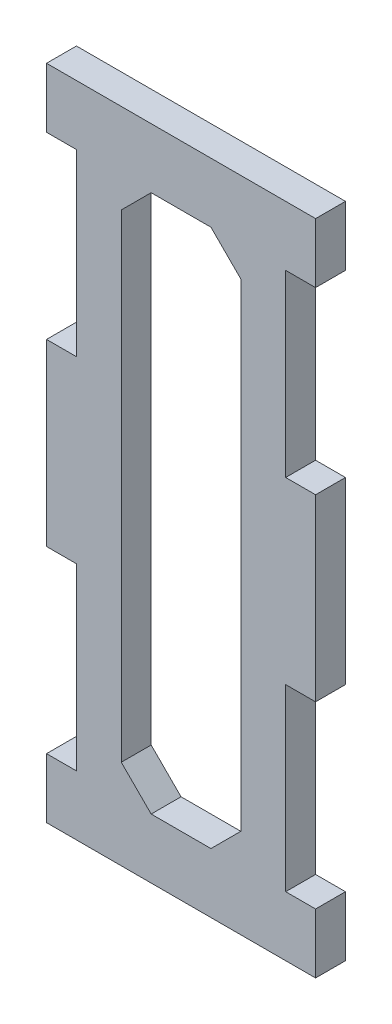
ISO-10303-21;
HEADER;
FILE_DESCRIPTION(('STEP AP214'),'2;1');
FILE_NAME('part.step','',(''),(''),'','','');
FILE_SCHEMA(('AUTOMOTIVE_DESIGN { 1 0 10303 214 1 1 1 1 }'));
ENDSEC;
DATA;
#1=APPLICATION_CONTEXT('core data for automotive mechanical design processes');
#2=APPLICATION_PROTOCOL_DEFINITION('international standard','automotive_design',2000,#1);
#3=PRODUCT_CONTEXT('',#1,'mechanical');
#4=PRODUCT('Part','Part','',(#3));
#5=PRODUCT_RELATED_PRODUCT_CATEGORY('part','',(#4));
#6=PRODUCT_DEFINITION_FORMATION('','',#4);
#7=PRODUCT_DEFINITION_CONTEXT('part definition',#1,'design');
#8=PRODUCT_DEFINITION('design','',#6,#7);
#9=PRODUCT_DEFINITION_SHAPE('','',#8);
#10=(LENGTH_UNIT() NAMED_UNIT(*) SI_UNIT(.MILLI.,.METRE.));
#11=(NAMED_UNIT(*) PLANE_ANGLE_UNIT() SI_UNIT($,.RADIAN.));
#12=(NAMED_UNIT(*) SI_UNIT($,.STERADIAN.) SOLID_ANGLE_UNIT());
#13=UNCERTAINTY_MEASURE_WITH_UNIT(LENGTH_MEASURE(1.E-05),#10,'distance_accuracy_value','');
#14=(GEOMETRIC_REPRESENTATION_CONTEXT(3) GLOBAL_UNCERTAINTY_ASSIGNED_CONTEXT((#13)) GLOBAL_UNIT_ASSIGNED_CONTEXT((#10,
#11,#12)) REPRESENTATION_CONTEXT('',''));
#15=CARTESIAN_POINT('',(0.,0.,0.));
#16=DIRECTION('',(0.,0.,1.));
#17=DIRECTION('',(1.,0.,0.));
#18=AXIS2_PLACEMENT_3D('',#15,#16,#17);
#19=CARTESIAN_POINT('',(0.,0.,10.));
#20=DIRECTION('',(1.,0.,0.));
#21=DIRECTION('',(0.,0.,-1.));
#22=AXIS2_PLACEMENT_3D('',#19,#20,#21);
#23=PLANE('',#22);
#24=DIRECTION('',(0.,-1.,0.));
#25=VECTOR('',#24,1.);
#26=CARTESIAN_POINT('',(0.,0.,0.));
#27=LINE('',#26,#25);
#28=CARTESIAN_POINT('',(0.,20.,0.));
#29=VERTEX_POINT('',#28);
#30=CARTESIAN_POINT('',(0.,0.,0.));
#31=VERTEX_POINT('',#30);
#32=EDGE_CURVE('E274',#29,#31,#27,.T.);
#33=ORIENTED_EDGE('',*,*,#32,.T.);
#34=DIRECTION('',(0.,0.,-1.));
#35=VECTOR('',#34,1.);
#36=CARTESIAN_POINT('',(0.,0.,10.));
#37=LINE('',#36,#35);
#38=CARTESIAN_POINT('',(0.,0.,10.));
#39=VERTEX_POINT('',#38);
#40=EDGE_CURVE('E11',#39,#31,#37,.T.);
#41=ORIENTED_EDGE('',*,*,#40,.F.);
#42=DIRECTION('',(0.,-1.,0.));
#43=VECTOR('',#42,1.);
#44=CARTESIAN_POINT('',(0.,0.,10.));
#45=LINE('',#44,#43);
#46=CARTESIAN_POINT('',(0.,20.,10.));
#47=VERTEX_POINT('',#46);
#48=EDGE_CURVE('E286',#47,#39,#45,.T.);
#49=ORIENTED_EDGE('',*,*,#48,.F.);
#50=DIRECTION('',(0.,0.,-1.));
#51=VECTOR('',#50,1.);
#52=CARTESIAN_POINT('',(0.,20.,10.));
#53=LINE('',#52,#51);
#54=EDGE_CURVE('E328',#47,#29,#53,.T.);
#55=ORIENTED_EDGE('',*,*,#54,.T.);
#56=EDGE_LOOP('',(#33,#41,#49,#55));
#57=FACE_BOUND('',#56,.T.);
#58=ADVANCED_FACE('F33',(#57),#23,.F.);
#59=CARTESIAN_POINT('',(0.,0.,10.));
#60=DIRECTION('',(0.,1.,0.));
#61=DIRECTION('',(-1.,0.,0.));
#62=AXIS2_PLACEMENT_3D('',#59,#60,#61);
#63=PLANE('',#62);
#64=DIRECTION('',(1.,0.,0.));
#65=VECTOR('',#64,1.);
#66=CARTESIAN_POINT('',(0.,0.,0.));
#67=LINE('',#66,#65);
#68=CARTESIAN_POINT('',(90.,0.,0.));
#69=VERTEX_POINT('',#68);
#70=EDGE_CURVE('E331',#31,#69,#67,.T.);
#71=ORIENTED_EDGE('',*,*,#70,.T.);
#72=DIRECTION('',(0.,0.,-1.));
#73=VECTOR('',#72,1.);
#74=CARTESIAN_POINT('',(90.,0.,10.));
#75=LINE('',#74,#73);
#76=CARTESIAN_POINT('',(90.,0.,10.));
#77=VERTEX_POINT('',#76);
#78=EDGE_CURVE('E40',#77,#69,#75,.T.);
#79=ORIENTED_EDGE('',*,*,#78,.F.);
#80=DIRECTION('',(1.,0.,0.));
#81=VECTOR('',#80,1.);
#82=CARTESIAN_POINT('',(0.,0.,10.));
#83=LINE('',#82,#81);
#84=EDGE_CURVE('E289',#39,#77,#83,.T.);
#85=ORIENTED_EDGE('',*,*,#84,.F.);
#86=ORIENTED_EDGE('',*,*,#40,.T.);
#87=EDGE_LOOP('',(#71,#79,#85,#86));
#88=FACE_BOUND('',#87,.T.);
#89=ADVANCED_FACE('F446',(#88),#63,.F.);
#90=CARTESIAN_POINT('',(90.,0.,10.));
#91=DIRECTION('',(-1.,0.,0.));
#92=DIRECTION('',(0.,0.,1.));
#93=AXIS2_PLACEMENT_3D('',#90,#91,#92);
#94=PLANE('',#93);
#95=DIRECTION('',(0.,1.,0.));
#96=VECTOR('',#95,1.);
#97=CARTESIAN_POINT('',(90.,0.,0.));
#98=LINE('',#97,#96);
#99=CARTESIAN_POINT('',(90.,20.,0.));
#100=VERTEX_POINT('',#99);
#101=EDGE_CURVE('E333',#69,#100,#98,.T.);
#102=ORIENTED_EDGE('',*,*,#101,.T.);
#103=DIRECTION('',(0.,0.,-1.));
#104=VECTOR('',#103,1.);
#105=CARTESIAN_POINT('',(90.,20.,10.));
#106=LINE('',#105,#104);
#107=CARTESIAN_POINT('',(90.,20.,10.));
#108=VERTEX_POINT('',#107);
#109=EDGE_CURVE('E418',#108,#100,#106,.T.);
#110=ORIENTED_EDGE('',*,*,#109,.F.);
#111=DIRECTION('',(0.,1.,0.));
#112=VECTOR('',#111,1.);
#113=CARTESIAN_POINT('',(90.,0.,10.));
#114=LINE('',#113,#112);
#115=EDGE_CURVE('E292',#77,#108,#114,.T.);
#116=ORIENTED_EDGE('',*,*,#115,.F.);
#117=ORIENTED_EDGE('',*,*,#78,.T.);
#118=EDGE_LOOP('',(#102,#110,#116,#117));
#119=FACE_BOUND('',#118,.T.);
#120=ADVANCED_FACE('F425',(#119),#94,.F.);
#121=CARTESIAN_POINT('',(90.,20.,10.));
#122=DIRECTION('',(0.,-1.,0.));
#123=DIRECTION('',(1.,0.,0.));
#124=AXIS2_PLACEMENT_3D('',#121,#122,#123);
#125=PLANE('',#124);
#126=DIRECTION('',(-1.,0.,0.));
#127=VECTOR('',#126,1.);
#128=CARTESIAN_POINT('',(90.,20.,0.));
#129=LINE('',#128,#127);
#130=CARTESIAN_POINT('',(80.,20.,0.));
#131=VERTEX_POINT('',#130);
#132=EDGE_CURVE('E335',#100,#131,#129,.T.);
#133=ORIENTED_EDGE('',*,*,#132,.T.);
#134=DIRECTION('',(0.,0.,-1.));
#135=VECTOR('',#134,1.);
#136=CARTESIAN_POINT('',(80.,20.,10.));
#137=LINE('',#136,#135);
#138=CARTESIAN_POINT('',(80.,20.,10.));
#139=VERTEX_POINT('',#138);
#140=EDGE_CURVE('E415',#139,#131,#137,.T.);
#141=ORIENTED_EDGE('',*,*,#140,.F.);
#142=DIRECTION('',(-1.,0.,0.));
#143=VECTOR('',#142,1.);
#144=CARTESIAN_POINT('',(90.,20.,10.));
#145=LINE('',#144,#143);
#146=EDGE_CURVE('E294',#108,#139,#145,.T.);
#147=ORIENTED_EDGE('',*,*,#146,.F.);
#148=ORIENTED_EDGE('',*,*,#109,.T.);
#149=EDGE_LOOP('',(#133,#141,#147,#148));
#150=FACE_BOUND('',#149,.T.);
#151=ADVANCED_FACE('F434',(#150),#125,.F.);
#152=CARTESIAN_POINT('',(80.,20.,10.));
#153=DIRECTION('',(-1.,0.,0.));
#154=DIRECTION('',(0.,-1.,0.));
#155=AXIS2_PLACEMENT_3D('',#152,#153,#154);
#156=PLANE('',#155);
#157=DIRECTION('',(0.,1.,0.));
#158=VECTOR('',#157,1.);
#159=CARTESIAN_POINT('',(80.,20.,0.));
#160=LINE('',#159,#158);
#161=CARTESIAN_POINT('',(80.,80.,0.));
#162=VERTEX_POINT('',#161);
#163=EDGE_CURVE('E337',#131,#162,#160,.T.);
#164=ORIENTED_EDGE('',*,*,#163,.T.);
#165=DIRECTION('',(0.,0.,-1.));
#166=VECTOR('',#165,1.);
#167=CARTESIAN_POINT('',(80.,80.,10.));
#168=LINE('',#167,#166);
#169=CARTESIAN_POINT('',(80.,80.,10.));
#170=VERTEX_POINT('',#169);
#171=EDGE_CURVE('E412',#170,#162,#168,.T.);
#172=ORIENTED_EDGE('',*,*,#171,.F.);
#173=DIRECTION('',(0.,1.,0.));
#174=VECTOR('',#173,1.);
#175=CARTESIAN_POINT('',(80.,20.,10.));
#176=LINE('',#175,#174);
#177=EDGE_CURVE('E296',#139,#170,#176,.T.);
#178=ORIENTED_EDGE('',*,*,#177,.F.);
#179=ORIENTED_EDGE('',*,*,#140,.T.);
#180=EDGE_LOOP('',(#164,#172,#178,#179));
#181=FACE_BOUND('',#180,.T.);
#182=ADVANCED_FACE('F438',(#181),#156,.F.);
#183=CARTESIAN_POINT('',(80.,80.,10.));
#184=DIRECTION('',(0.,1.,0.));
#185=DIRECTION('',(0.,0.,1.));
#186=AXIS2_PLACEMENT_3D('',#183,#184,#185);
#187=PLANE('',#186);
#188=DIRECTION('',(1.,0.,0.));
#189=VECTOR('',#188,1.);
#190=CARTESIAN_POINT('',(80.,80.,0.));
#191=LINE('',#190,#189);
#192=CARTESIAN_POINT('',(90.,80.,0.));
#193=VERTEX_POINT('',#192);
#194=EDGE_CURVE('E339',#162,#193,#191,.T.);
#195=ORIENTED_EDGE('',*,*,#194,.T.);
#196=DIRECTION('',(0.,0.,-1.));
#197=VECTOR('',#196,1.);
#198=CARTESIAN_POINT('',(90.,80.,10.));
#199=LINE('',#198,#197);
#200=CARTESIAN_POINT('',(90.,80.,10.));
#201=VERTEX_POINT('',#200);
#202=EDGE_CURVE('E409',#201,#193,#199,.T.);
#203=ORIENTED_EDGE('',*,*,#202,.F.);
#204=DIRECTION('',(1.,0.,0.));
#205=VECTOR('',#204,1.);
#206=CARTESIAN_POINT('',(80.,80.,10.));
#207=LINE('',#206,#205);
#208=EDGE_CURVE('E298',#170,#201,#207,.T.);
#209=ORIENTED_EDGE('',*,*,#208,.F.);
#210=ORIENTED_EDGE('',*,*,#171,.T.);
#211=EDGE_LOOP('',(#195,#203,#209,#210));
#212=FACE_BOUND('',#211,.T.);
#213=ADVANCED_FACE('F519',(#212),#187,.F.);
#214=CARTESIAN_POINT('',(90.,80.,10.));
#215=DIRECTION('',(-1.,0.,0.));
#216=DIRECTION('',(0.,0.,1.));
#217=AXIS2_PLACEMENT_3D('',#214,#215,#216);
#218=PLANE('',#217);
#219=DIRECTION('',(0.,1.,0.));
#220=VECTOR('',#219,1.);
#221=CARTESIAN_POINT('',(90.,80.,0.));
#222=LINE('',#221,#220);
#223=CARTESIAN_POINT('',(90.,140.,0.));
#224=VERTEX_POINT('',#223);
#225=EDGE_CURVE('E341',#193,#224,#222,.T.);
#226=ORIENTED_EDGE('',*,*,#225,.T.);
#227=DIRECTION('',(0.,0.,-1.));
#228=VECTOR('',#227,1.);
#229=CARTESIAN_POINT('',(90.,140.,10.));
#230=LINE('',#229,#228);
#231=CARTESIAN_POINT('',(90.,140.,10.));
#232=VERTEX_POINT('',#231);
#233=EDGE_CURVE('E406',#232,#224,#230,.T.);
#234=ORIENTED_EDGE('',*,*,#233,.F.);
#235=DIRECTION('',(0.,1.,0.));
#236=VECTOR('',#235,1.);
#237=CARTESIAN_POINT('',(90.,80.,10.));
#238=LINE('',#237,#236);
#239=EDGE_CURVE('E300',#201,#232,#238,.T.);
#240=ORIENTED_EDGE('',*,*,#239,.F.);
#241=ORIENTED_EDGE('',*,*,#202,.T.);
#242=EDGE_LOOP('',(#226,#234,#240,#241));
#243=FACE_BOUND('',#242,.T.);
#244=ADVANCED_FACE('F517',(#243),#218,.F.);
#245=CARTESIAN_POINT('',(90.,140.,10.));
#246=DIRECTION('',(0.,-1.,0.));
#247=DIRECTION('',(0.,0.,-1.));
#248=AXIS2_PLACEMENT_3D('',#245,#246,#247);
#249=PLANE('',#248);
#250=DIRECTION('',(-1.,0.,0.));
#251=VECTOR('',#250,1.);
#252=CARTESIAN_POINT('',(90.,140.,0.));
#253=LINE('',#252,#251);
#254=CARTESIAN_POINT('',(80.,140.,0.));
#255=VERTEX_POINT('',#254);
#256=EDGE_CURVE('E343',#224,#255,#253,.T.);
#257=ORIENTED_EDGE('',*,*,#256,.T.);
#258=DIRECTION('',(0.,0.,-1.));
#259=VECTOR('',#258,1.);
#260=CARTESIAN_POINT('',(80.,140.,10.));
#261=LINE('',#260,#259);
#262=CARTESIAN_POINT('',(80.,140.,10.));
#263=VERTEX_POINT('',#262);
#264=EDGE_CURVE('E403',#263,#255,#261,.T.);
#265=ORIENTED_EDGE('',*,*,#264,.F.);
#266=DIRECTION('',(-1.,0.,0.));
#267=VECTOR('',#266,1.);
#268=CARTESIAN_POINT('',(90.,140.,10.));
#269=LINE('',#268,#267);
#270=EDGE_CURVE('E302',#232,#263,#269,.T.);
#271=ORIENTED_EDGE('',*,*,#270,.F.);
#272=ORIENTED_EDGE('',*,*,#233,.T.);
#273=EDGE_LOOP('',(#257,#265,#271,#272));
#274=FACE_BOUND('',#273,.T.);
#275=ADVANCED_FACE('F512',(#274),#249,.F.);
#276=CARTESIAN_POINT('',(80.,140.,10.));
#277=DIRECTION('',(-1.,0.,0.));
#278=DIRECTION('',(0.,-1.,0.));
#279=AXIS2_PLACEMENT_3D('',#276,#277,#278);
#280=PLANE('',#279);
#281=DIRECTION('',(0.,1.,0.));
#282=VECTOR('',#281,1.);
#283=CARTESIAN_POINT('',(80.,140.,0.));
#284=LINE('',#283,#282);
#285=CARTESIAN_POINT('',(79.9999999999999,200.,0.));
#286=VERTEX_POINT('',#285);
#287=EDGE_CURVE('E345',#255,#286,#284,.T.);
#288=ORIENTED_EDGE('',*,*,#287,.T.);
#289=DIRECTION('',(0.,0.,-1.));
#290=VECTOR('',#289,1.);
#291=CARTESIAN_POINT('',(79.9999999999999,200.,10.));
#292=LINE('',#291,#290);
#293=CARTESIAN_POINT('',(79.9999999999999,200.,10.));
#294=VERTEX_POINT('',#293);
#295=EDGE_CURVE('E400',#294,#286,#292,.T.);
#296=ORIENTED_EDGE('',*,*,#295,.F.);
#297=DIRECTION('',(0.,1.,0.));
#298=VECTOR('',#297,1.);
#299=CARTESIAN_POINT('',(80.,140.,10.));
#300=LINE('',#299,#298);
#301=EDGE_CURVE('E304',#263,#294,#300,.T.);
#302=ORIENTED_EDGE('',*,*,#301,.F.);
#303=ORIENTED_EDGE('',*,*,#264,.T.);
#304=EDGE_LOOP('',(#288,#296,#302,#303));
#305=FACE_BOUND('',#304,.T.);
#306=ADVANCED_FACE('F507',(#305),#280,.F.);
#307=CARTESIAN_POINT('',(79.9999999999999,200.,10.));
#308=DIRECTION('',(0.,1.,0.));
#309=DIRECTION('',(0.,0.,1.));
#310=AXIS2_PLACEMENT_3D('',#307,#308,#309);
#311=PLANE('',#310);
#312=DIRECTION('',(1.,0.,0.));
#313=VECTOR('',#312,1.);
#314=CARTESIAN_POINT('',(79.9999999999999,200.,0.));
#315=LINE('',#314,#313);
#316=CARTESIAN_POINT('',(89.9999999999999,200.,0.));
#317=VERTEX_POINT('',#316);
#318=EDGE_CURVE('E347',#286,#317,#315,.T.);
#319=ORIENTED_EDGE('',*,*,#318,.T.);
#320=DIRECTION('',(0.,0.,-1.));
#321=VECTOR('',#320,1.);
#322=CARTESIAN_POINT('',(89.9999999999999,200.,10.));
#323=LINE('',#322,#321);
#324=CARTESIAN_POINT('',(89.9999999999999,200.,10.));
#325=VERTEX_POINT('',#324);
#326=EDGE_CURVE('E397',#325,#317,#323,.T.);
#327=ORIENTED_EDGE('',*,*,#326,.F.);
#328=DIRECTION('',(1.,0.,0.));
#329=VECTOR('',#328,1.);
#330=CARTESIAN_POINT('',(79.9999999999999,200.,10.));
#331=LINE('',#330,#329);
#332=EDGE_CURVE('E306',#294,#325,#331,.T.);
#333=ORIENTED_EDGE('',*,*,#332,.F.);
#334=ORIENTED_EDGE('',*,*,#295,.T.);
#335=EDGE_LOOP('',(#319,#327,#333,#334));
#336=FACE_BOUND('',#335,.T.);
#337=ADVANCED_FACE('F503',(#336),#311,.F.);
#338=CARTESIAN_POINT('',(89.9999999999999,200.,10.));
#339=DIRECTION('',(-1.,0.,0.));
#340=DIRECTION('',(0.,-1.,0.));
#341=AXIS2_PLACEMENT_3D('',#338,#339,#340);
#342=PLANE('',#341);
#343=DIRECTION('',(0.,1.,0.));
#344=VECTOR('',#343,1.);
#345=CARTESIAN_POINT('',(89.9999999999999,200.,0.));
#346=LINE('',#345,#344);
#347=CARTESIAN_POINT('',(89.9999999999999,220.,0.));
#348=VERTEX_POINT('',#347);
#349=EDGE_CURVE('E349',#317,#348,#346,.T.);
#350=ORIENTED_EDGE('',*,*,#349,.T.);
#351=DIRECTION('',(0.,0.,-1.));
#352=VECTOR('',#351,1.);
#353=CARTESIAN_POINT('',(89.9999999999999,220.,10.));
#354=LINE('',#353,#352);
#355=CARTESIAN_POINT('',(89.9999999999999,220.,10.));
#356=VERTEX_POINT('',#355);
#357=EDGE_CURVE('E394',#356,#348,#354,.T.);
#358=ORIENTED_EDGE('',*,*,#357,.F.);
#359=DIRECTION('',(0.,1.,0.));
#360=VECTOR('',#359,1.);
#361=CARTESIAN_POINT('',(89.9999999999999,200.,10.));
#362=LINE('',#361,#360);
#363=EDGE_CURVE('E308',#325,#356,#362,.T.);
#364=ORIENTED_EDGE('',*,*,#363,.F.);
#365=ORIENTED_EDGE('',*,*,#326,.T.);
#366=EDGE_LOOP('',(#350,#358,#364,#365));
#367=FACE_BOUND('',#366,.T.);
#368=ADVANCED_FACE('F498',(#367),#342,.F.);
#369=CARTESIAN_POINT('',(0.,220.,10.));
#370=DIRECTION('',(0.,-1.,0.));
#371=DIRECTION('',(0.,0.,-1.));
#372=AXIS2_PLACEMENT_3D('',#369,#370,#371);
#373=PLANE('',#372);
#374=DIRECTION('',(-1.,0.,0.));
#375=VECTOR('',#374,1.);
#376=CARTESIAN_POINT('',(0.,220.,0.));
#377=LINE('',#376,#375);
#378=CARTESIAN_POINT('',(0.,220.,0.));
#379=VERTEX_POINT('',#378);
#380=EDGE_CURVE('E351',#348,#379,#377,.T.);
#381=ORIENTED_EDGE('',*,*,#380,.T.);
#382=DIRECTION('',(0.,0.,-1.));
#383=VECTOR('',#382,1.);
#384=CARTESIAN_POINT('',(0.,220.,10.));
#385=LINE('',#384,#383);
#386=CARTESIAN_POINT('',(0.,220.,10.));
#387=VERTEX_POINT('',#386);
#388=EDGE_CURVE('E391',#387,#379,#385,.T.);
#389=ORIENTED_EDGE('',*,*,#388,.F.);
#390=DIRECTION('',(-1.,0.,0.));
#391=VECTOR('',#390,1.);
#392=CARTESIAN_POINT('',(0.,220.,10.));
#393=LINE('',#392,#391);
#394=EDGE_CURVE('E310',#356,#387,#393,.T.);
#395=ORIENTED_EDGE('',*,*,#394,.F.);
#396=ORIENTED_EDGE('',*,*,#357,.T.);
#397=EDGE_LOOP('',(#381,#389,#395,#396));
#398=FACE_BOUND('',#397,.T.);
#399=ADVANCED_FACE('F492',(#398),#373,.F.);
#400=CARTESIAN_POINT('',(0.,200.,10.));
#401=DIRECTION('',(1.,0.,0.));
#402=DIRECTION('',(0.,0.,-1.));
#403=AXIS2_PLACEMENT_3D('',#400,#401,#402);
#404=PLANE('',#403);
#405=DIRECTION('',(0.,-1.,0.));
#406=VECTOR('',#405,1.);
#407=CARTESIAN_POINT('',(0.,200.,0.));
#408=LINE('',#407,#406);
#409=CARTESIAN_POINT('',(0.,200.,0.));
#410=VERTEX_POINT('',#409);
#411=EDGE_CURVE('E353',#379,#410,#408,.T.);
#412=ORIENTED_EDGE('',*,*,#411,.T.);
#413=DIRECTION('',(0.,0.,-1.));
#414=VECTOR('',#413,1.);
#415=CARTESIAN_POINT('',(0.,200.,10.));
#416=LINE('',#415,#414);
#417=CARTESIAN_POINT('',(0.,200.,10.));
#418=VERTEX_POINT('',#417);
#419=EDGE_CURVE('E388',#418,#410,#416,.T.);
#420=ORIENTED_EDGE('',*,*,#419,.F.);
#421=DIRECTION('',(0.,-1.,0.));
#422=VECTOR('',#421,1.);
#423=CARTESIAN_POINT('',(0.,200.,10.));
#424=LINE('',#423,#422);
#425=EDGE_CURVE('E312',#387,#418,#424,.T.);
#426=ORIENTED_EDGE('',*,*,#425,.F.);
#427=ORIENTED_EDGE('',*,*,#388,.T.);
#428=EDGE_LOOP('',(#412,#420,#426,#427));
#429=FACE_BOUND('',#428,.T.);
#430=ADVANCED_FACE('F488',(#429),#404,.F.);
#431=CARTESIAN_POINT('',(10.,200.,10.));
#432=DIRECTION('',(0.,1.,0.));
#433=DIRECTION('',(0.,0.,1.));
#434=AXIS2_PLACEMENT_3D('',#431,#432,#433);
#435=PLANE('',#434);
#436=DIRECTION('',(1.,0.,0.));
#437=VECTOR('',#436,1.);
#438=CARTESIAN_POINT('',(10.,200.,0.));
#439=LINE('',#438,#437);
#440=CARTESIAN_POINT('',(10.,200.,0.));
#441=VERTEX_POINT('',#440);
#442=EDGE_CURVE('E355',#410,#441,#439,.T.);
#443=ORIENTED_EDGE('',*,*,#442,.T.);
#444=DIRECTION('',(0.,0.,-1.));
#445=VECTOR('',#444,1.);
#446=CARTESIAN_POINT('',(10.,200.,10.));
#447=LINE('',#446,#445);
#448=CARTESIAN_POINT('',(10.,200.,10.));
#449=VERTEX_POINT('',#448);
#450=EDGE_CURVE('E385',#449,#441,#447,.T.);
#451=ORIENTED_EDGE('',*,*,#450,.F.);
#452=DIRECTION('',(1.,0.,0.));
#453=VECTOR('',#452,1.);
#454=CARTESIAN_POINT('',(10.,200.,10.));
#455=LINE('',#454,#453);
#456=EDGE_CURVE('E314',#418,#449,#455,.T.);
#457=ORIENTED_EDGE('',*,*,#456,.F.);
#458=ORIENTED_EDGE('',*,*,#419,.T.);
#459=EDGE_LOOP('',(#443,#451,#457,#458));
#460=FACE_BOUND('',#459,.T.);
#461=ADVANCED_FACE('F483',(#460),#435,.F.);
#462=CARTESIAN_POINT('',(10.,140.,10.));
#463=DIRECTION('',(1.,0.,0.));
#464=DIRECTION('',(0.,1.,0.));
#465=AXIS2_PLACEMENT_3D('',#462,#463,#464);
#466=PLANE('',#465);
#467=DIRECTION('',(0.,-1.,0.));
#468=VECTOR('',#467,1.);
#469=CARTESIAN_POINT('',(10.,140.,0.));
#470=LINE('',#469,#468);
#471=CARTESIAN_POINT('',(10.,140.,0.));
#472=VERTEX_POINT('',#471);
#473=EDGE_CURVE('E357',#441,#472,#470,.T.);
#474=ORIENTED_EDGE('',*,*,#473,.T.);
#475=DIRECTION('',(0.,0.,-1.));
#476=VECTOR('',#475,1.);
#477=CARTESIAN_POINT('',(10.,140.,10.));
#478=LINE('',#477,#476);
#479=CARTESIAN_POINT('',(10.,140.,10.));
#480=VERTEX_POINT('',#479);
#481=EDGE_CURVE('E382',#480,#472,#478,.T.);
#482=ORIENTED_EDGE('',*,*,#481,.F.);
#483=DIRECTION('',(0.,-1.,0.));
#484=VECTOR('',#483,1.);
#485=CARTESIAN_POINT('',(10.,140.,10.));
#486=LINE('',#485,#484);
#487=EDGE_CURVE('E316',#449,#480,#486,.T.);
#488=ORIENTED_EDGE('',*,*,#487,.F.);
#489=ORIENTED_EDGE('',*,*,#450,.T.);
#490=EDGE_LOOP('',(#474,#482,#488,#489));
#491=FACE_BOUND('',#490,.T.);
#492=ADVANCED_FACE('F477',(#491),#466,.F.);
#493=CARTESIAN_POINT('',(0.,140.,10.));
#494=DIRECTION('',(0.,-1.,0.));
#495=DIRECTION('',(0.,0.,-1.));
#496=AXIS2_PLACEMENT_3D('',#493,#494,#495);
#497=PLANE('',#496);
#498=DIRECTION('',(-1.,0.,0.));
#499=VECTOR('',#498,1.);
#500=CARTESIAN_POINT('',(0.,140.,0.));
#501=LINE('',#500,#499);
#502=CARTESIAN_POINT('',(0.,140.,0.));
#503=VERTEX_POINT('',#502);
#504=EDGE_CURVE('E359',#472,#503,#501,.T.);
#505=ORIENTED_EDGE('',*,*,#504,.T.);
#506=DIRECTION('',(0.,0.,-1.));
#507=VECTOR('',#506,1.);
#508=CARTESIAN_POINT('',(0.,140.,10.));
#509=LINE('',#508,#507);
#510=CARTESIAN_POINT('',(0.,140.,10.));
#511=VERTEX_POINT('',#510);
#512=EDGE_CURVE('E379',#511,#503,#509,.T.);
#513=ORIENTED_EDGE('',*,*,#512,.F.);
#514=DIRECTION('',(-1.,0.,0.));
#515=VECTOR('',#514,1.);
#516=CARTESIAN_POINT('',(0.,140.,10.));
#517=LINE('',#516,#515);
#518=EDGE_CURVE('E318',#480,#511,#517,.T.);
#519=ORIENTED_EDGE('',*,*,#518,.F.);
#520=ORIENTED_EDGE('',*,*,#481,.T.);
#521=EDGE_LOOP('',(#505,#513,#519,#520));
#522=FACE_BOUND('',#521,.T.);
#523=ADVANCED_FACE('F473',(#522),#497,.F.);
#524=CARTESIAN_POINT('',(0.,80.,10.));
#525=DIRECTION('',(1.,0.,0.));
#526=DIRECTION('',(0.,1.,0.));
#527=AXIS2_PLACEMENT_3D('',#524,#525,#526);
#528=PLANE('',#527);
#529=DIRECTION('',(0.,-1.,0.));
#530=VECTOR('',#529,1.);
#531=CARTESIAN_POINT('',(0.,80.,0.));
#532=LINE('',#531,#530);
#533=CARTESIAN_POINT('',(0.,80.,0.));
#534=VERTEX_POINT('',#533);
#535=EDGE_CURVE('E361',#503,#534,#532,.T.);
#536=ORIENTED_EDGE('',*,*,#535,.T.);
#537=DIRECTION('',(0.,0.,-1.));
#538=VECTOR('',#537,1.);
#539=CARTESIAN_POINT('',(0.,80.,10.));
#540=LINE('',#539,#538);
#541=CARTESIAN_POINT('',(0.,80.,10.));
#542=VERTEX_POINT('',#541);
#543=EDGE_CURVE('E376',#542,#534,#540,.T.);
#544=ORIENTED_EDGE('',*,*,#543,.F.);
#545=DIRECTION('',(0.,-1.,0.));
#546=VECTOR('',#545,1.);
#547=CARTESIAN_POINT('',(0.,80.,10.));
#548=LINE('',#547,#546);
#549=EDGE_CURVE('E320',#511,#542,#548,.T.);
#550=ORIENTED_EDGE('',*,*,#549,.F.);
#551=ORIENTED_EDGE('',*,*,#512,.T.);
#552=EDGE_LOOP('',(#536,#544,#550,#551));
#553=FACE_BOUND('',#552,.T.);
#554=ADVANCED_FACE('F468',(#553),#528,.F.);
#555=CARTESIAN_POINT('',(10.,80.,10.));
#556=DIRECTION('',(0.,1.,0.));
#557=DIRECTION('',(0.,0.,1.));
#558=AXIS2_PLACEMENT_3D('',#555,#556,#557);
#559=PLANE('',#558);
#560=DIRECTION('',(1.,0.,0.));
#561=VECTOR('',#560,1.);
#562=CARTESIAN_POINT('',(10.,80.,0.));
#563=LINE('',#562,#561);
#564=CARTESIAN_POINT('',(10.,80.,0.));
#565=VERTEX_POINT('',#564);
#566=EDGE_CURVE('E363',#534,#565,#563,.T.);
#567=ORIENTED_EDGE('',*,*,#566,.T.);
#568=DIRECTION('',(0.,0.,-1.));
#569=VECTOR('',#568,1.);
#570=CARTESIAN_POINT('',(10.,80.,10.));
#571=LINE('',#570,#569);
#572=CARTESIAN_POINT('',(10.,80.,10.));
#573=VERTEX_POINT('',#572);
#574=EDGE_CURVE('E373',#573,#565,#571,.T.);
#575=ORIENTED_EDGE('',*,*,#574,.F.);
#576=DIRECTION('',(1.,0.,0.));
#577=VECTOR('',#576,1.);
#578=CARTESIAN_POINT('',(10.,80.,10.));
#579=LINE('',#578,#577);
#580=EDGE_CURVE('E322',#542,#573,#579,.T.);
#581=ORIENTED_EDGE('',*,*,#580,.F.);
#582=ORIENTED_EDGE('',*,*,#543,.T.);
#583=EDGE_LOOP('',(#567,#575,#581,#582));
#584=FACE_BOUND('',#583,.T.);
#585=ADVANCED_FACE('F462',(#584),#559,.F.);
#586=CARTESIAN_POINT('',(10.,20.,10.));
#587=DIRECTION('',(1.,0.,0.));
#588=DIRECTION('',(0.,1.,0.));
#589=AXIS2_PLACEMENT_3D('',#586,#587,#588);
#590=PLANE('',#589);
#591=DIRECTION('',(0.,-1.,0.));
#592=VECTOR('',#591,1.);
#593=CARTESIAN_POINT('',(10.,20.,0.));
#594=LINE('',#593,#592);
#595=CARTESIAN_POINT('',(10.,20.,0.));
#596=VERTEX_POINT('',#595);
#597=EDGE_CURVE('E365',#565,#596,#594,.T.);
#598=ORIENTED_EDGE('',*,*,#597,.T.);
#599=DIRECTION('',(0.,0.,-1.));
#600=VECTOR('',#599,1.);
#601=CARTESIAN_POINT('',(10.,20.,10.));
#602=LINE('',#601,#600);
#603=CARTESIAN_POINT('',(10.,20.,10.));
#604=VERTEX_POINT('',#603);
#605=EDGE_CURVE('E370',#604,#596,#602,.T.);
#606=ORIENTED_EDGE('',*,*,#605,.F.);
#607=DIRECTION('',(0.,-1.,0.));
#608=VECTOR('',#607,1.);
#609=CARTESIAN_POINT('',(10.,20.,10.));
#610=LINE('',#609,#608);
#611=EDGE_CURVE('E324',#573,#604,#610,.T.);
#612=ORIENTED_EDGE('',*,*,#611,.F.);
#613=ORIENTED_EDGE('',*,*,#574,.T.);
#614=EDGE_LOOP('',(#598,#606,#612,#613));
#615=FACE_BOUND('',#614,.T.);
#616=ADVANCED_FACE('F458',(#615),#590,.F.);
#617=CARTESIAN_POINT('',(0.,20.,10.));
#618=DIRECTION('',(0.,-1.,0.));
#619=DIRECTION('',(0.,0.,-1.));
#620=AXIS2_PLACEMENT_3D('',#617,#618,#619);
#621=PLANE('',#620);
#622=DIRECTION('',(-1.,0.,0.));
#623=VECTOR('',#622,1.);
#624=CARTESIAN_POINT('',(0.,20.,0.));
#625=LINE('',#624,#623);
#626=EDGE_CURVE('E290',#596,#29,#625,.T.);
#627=ORIENTED_EDGE('',*,*,#626,.T.);
#628=ORIENTED_EDGE('',*,*,#54,.F.);
#629=DIRECTION('',(-1.,0.,0.));
#630=VECTOR('',#629,1.);
#631=CARTESIAN_POINT('',(0.,20.,10.));
#632=LINE('',#631,#630);
#633=EDGE_CURVE('E326',#604,#47,#632,.T.);
#634=ORIENTED_EDGE('',*,*,#633,.F.);
#635=ORIENTED_EDGE('',*,*,#605,.T.);
#636=EDGE_LOOP('',(#627,#628,#634,#635));
#637=FACE_BOUND('',#636,.T.);
#638=ADVANCED_FACE('F453',(#637),#621,.F.);
#639=CARTESIAN_POINT('',(0.,0.,10.));
#640=DIRECTION('',(0.,0.,-1.));
#641=DIRECTION('',(-1.,0.,0.));
#642=AXIS2_PLACEMENT_3D('',#639,#640,#641);
#643=PLANE('',#642);
#644=DIRECTION('',(0.,-1.,0.));
#645=VECTOR('',#644,1.);
#646=CARTESIAN_POINT('',(25.,190.,10.));
#647=LINE('',#646,#645);
#648=CARTESIAN_POINT('',(25.,190.,10.));
#649=VERTEX_POINT('',#648);
#650=CARTESIAN_POINT('',(25.,30.,10.));
#651=VERTEX_POINT('',#650);
#652=EDGE_CURVE('E256',#649,#651,#647,.T.);
#653=ORIENTED_EDGE('',*,*,#652,.F.);
#654=DIRECTION('',(-0.707106781186547,-0.707106781186548,0.));
#655=VECTOR('',#654,1.);
#656=CARTESIAN_POINT('',(25.,190.,10.));
#657=LINE('',#656,#655);
#658=CARTESIAN_POINT('',(35.,200.,10.));
#659=VERTEX_POINT('',#658);
#660=EDGE_CURVE('E47',#659,#649,#657,.T.);
#661=ORIENTED_EDGE('',*,*,#660,.F.);
#662=DIRECTION('',(-1.,0.,0.));
#663=VECTOR('',#662,1.);
#664=CARTESIAN_POINT('',(35.,200.,10.));
#665=LINE('',#664,#663);
#666=CARTESIAN_POINT('',(55.,200.,10.));
#667=VERTEX_POINT('',#666);
#668=EDGE_CURVE('E236',#667,#659,#665,.T.);
#669=ORIENTED_EDGE('',*,*,#668,.F.);
#670=DIRECTION('',(-0.707106781186547,0.707106781186548,0.));
#671=VECTOR('',#670,1.);
#672=CARTESIAN_POINT('',(55.,200.,10.));
#673=LINE('',#672,#671);
#674=CARTESIAN_POINT('',(65.,190.,10.));
#675=VERTEX_POINT('',#674);
#676=EDGE_CURVE('E239',#675,#667,#673,.T.);
#677=ORIENTED_EDGE('',*,*,#676,.F.);
#678=DIRECTION('',(0.,1.,0.));
#679=VECTOR('',#678,1.);
#680=CARTESIAN_POINT('',(65.,190.,10.));
#681=LINE('',#680,#679);
#682=CARTESIAN_POINT('',(65.,30.,10.));
#683=VERTEX_POINT('',#682);
#684=EDGE_CURVE('E267',#683,#675,#681,.T.);
#685=ORIENTED_EDGE('',*,*,#684,.F.);
#686=DIRECTION('',(0.707106781186548,0.707106781186547,0.));
#687=VECTOR('',#686,1.);
#688=CARTESIAN_POINT('',(55.,20.,10.));
#689=LINE('',#688,#687);
#690=CARTESIAN_POINT('',(55.,20.,10.));
#691=VERTEX_POINT('',#690);
#692=EDGE_CURVE('E264',#691,#683,#689,.T.);
#693=ORIENTED_EDGE('',*,*,#692,.F.);
#694=DIRECTION('',(1.,0.,0.));
#695=VECTOR('',#694,1.);
#696=CARTESIAN_POINT('',(35.,20.,10.));
#697=LINE('',#696,#695);
#698=CARTESIAN_POINT('',(35.,20.,10.));
#699=VERTEX_POINT('',#698);
#700=EDGE_CURVE('E261',#699,#691,#697,.T.);
#701=ORIENTED_EDGE('',*,*,#700,.F.);
#702=DIRECTION('',(0.707106781186548,-0.707106781186548,0.));
#703=VECTOR('',#702,1.);
#704=CARTESIAN_POINT('',(25.,30.,10.));
#705=LINE('',#704,#703);
#706=EDGE_CURVE('E258',#651,#699,#705,.T.);
#707=ORIENTED_EDGE('',*,*,#706,.F.);
#708=EDGE_LOOP('',(#653,#661,#669,#677,#685,#693,#701,#707));
#709=FACE_BOUND('',#708,.T.);
#710=ORIENTED_EDGE('',*,*,#48,.T.);
#711=ORIENTED_EDGE('',*,*,#84,.T.);
#712=ORIENTED_EDGE('',*,*,#115,.T.);
#713=ORIENTED_EDGE('',*,*,#146,.T.);
#714=ORIENTED_EDGE('',*,*,#177,.T.);
#715=ORIENTED_EDGE('',*,*,#208,.T.);
#716=ORIENTED_EDGE('',*,*,#239,.T.);
#717=ORIENTED_EDGE('',*,*,#270,.T.);
#718=ORIENTED_EDGE('',*,*,#301,.T.);
#719=ORIENTED_EDGE('',*,*,#332,.T.);
#720=ORIENTED_EDGE('',*,*,#363,.T.);
#721=ORIENTED_EDGE('',*,*,#394,.T.);
#722=ORIENTED_EDGE('',*,*,#425,.T.);
#723=ORIENTED_EDGE('',*,*,#456,.T.);
#724=ORIENTED_EDGE('',*,*,#487,.T.);
#725=ORIENTED_EDGE('',*,*,#518,.T.);
#726=ORIENTED_EDGE('',*,*,#549,.T.);
#727=ORIENTED_EDGE('',*,*,#580,.T.);
#728=ORIENTED_EDGE('',*,*,#611,.T.);
#729=ORIENTED_EDGE('',*,*,#633,.T.);
#730=EDGE_LOOP('',(#710,#711,#712,#713,#714,#715,#716,#717,#718,#719,#720,#721,#722,#723,#724,
#725,#726,#727,#728,#729));
#731=FACE_BOUND('',#730,.T.);
#732=ADVANCED_FACE('F442',(#709,#731),#643,.F.);
#733=CARTESIAN_POINT('',(0.,0.,0.));
#734=DIRECTION('',(0.,0.,-1.));
#735=DIRECTION('',(-1.,0.,0.));
#736=AXIS2_PLACEMENT_3D('',#733,#734,#735);
#737=PLANE('',#736);
#738=DIRECTION('',(-0.707106781186547,-0.707106781186548,0.));
#739=VECTOR('',#738,1.);
#740=CARTESIAN_POINT('',(25.,190.,0.));
#741=LINE('',#740,#739);
#742=CARTESIAN_POINT('',(35.,200.,0.));
#743=VERTEX_POINT('',#742);
#744=CARTESIAN_POINT('',(25.,190.,0.));
#745=VERTEX_POINT('',#744);
#746=EDGE_CURVE('E219',#743,#745,#741,.T.);
#747=ORIENTED_EDGE('',*,*,#746,.T.);
#748=DIRECTION('',(0.,-1.,0.));
#749=VECTOR('',#748,1.);
#750=CARTESIAN_POINT('',(25.,190.,0.));
#751=LINE('',#750,#749);
#752=CARTESIAN_POINT('',(25.,30.,0.));
#753=VERTEX_POINT('',#752);
#754=EDGE_CURVE('E228',#745,#753,#751,.T.);
#755=ORIENTED_EDGE('',*,*,#754,.T.);
#756=DIRECTION('',(0.707106781186548,-0.707106781186548,0.));
#757=VECTOR('',#756,1.);
#758=CARTESIAN_POINT('',(25.,30.,0.));
#759=LINE('',#758,#757);
#760=CARTESIAN_POINT('',(35.,20.,0.));
#761=VERTEX_POINT('',#760);
#762=EDGE_CURVE('E55',#753,#761,#759,.T.);
#763=ORIENTED_EDGE('',*,*,#762,.T.);
#764=DIRECTION('',(1.,0.,0.));
#765=VECTOR('',#764,1.);
#766=CARTESIAN_POINT('',(35.,20.,0.));
#767=LINE('',#766,#765);
#768=CARTESIAN_POINT('',(55.,20.,0.));
#769=VERTEX_POINT('',#768);
#770=EDGE_CURVE('E243',#761,#769,#767,.T.);
#771=ORIENTED_EDGE('',*,*,#770,.T.);
#772=DIRECTION('',(0.707106781186548,0.707106781186547,0.));
#773=VECTOR('',#772,1.);
#774=CARTESIAN_POINT('',(55.,20.,0.));
#775=LINE('',#774,#773);
#776=CARTESIAN_POINT('',(65.,30.,0.));
#777=VERTEX_POINT('',#776);
#778=EDGE_CURVE('E246',#769,#777,#775,.T.);
#779=ORIENTED_EDGE('',*,*,#778,.T.);
#780=DIRECTION('',(0.,1.,0.));
#781=VECTOR('',#780,1.);
#782=CARTESIAN_POINT('',(65.,190.,0.));
#783=LINE('',#782,#781);
#784=CARTESIAN_POINT('',(65.,190.,0.));
#785=VERTEX_POINT('',#784);
#786=EDGE_CURVE('E249',#777,#785,#783,.T.);
#787=ORIENTED_EDGE('',*,*,#786,.T.);
#788=DIRECTION('',(-0.707106781186547,0.707106781186548,0.));
#789=VECTOR('',#788,1.);
#790=CARTESIAN_POINT('',(55.,200.,0.));
#791=LINE('',#790,#789);
#792=CARTESIAN_POINT('',(55.,200.,0.));
#793=VERTEX_POINT('',#792);
#794=EDGE_CURVE('E252',#785,#793,#791,.T.);
#795=ORIENTED_EDGE('',*,*,#794,.T.);
#796=DIRECTION('',(-1.,0.,0.));
#797=VECTOR('',#796,1.);
#798=CARTESIAN_POINT('',(35.,200.,0.));
#799=LINE('',#798,#797);
#800=EDGE_CURVE('E225',#793,#743,#799,.T.);
#801=ORIENTED_EDGE('',*,*,#800,.T.);
#802=EDGE_LOOP('',(#747,#755,#763,#771,#779,#787,#795,#801));
#803=FACE_BOUND('',#802,.T.);
#804=ORIENTED_EDGE('',*,*,#32,.F.);
#805=ORIENTED_EDGE('',*,*,#626,.F.);
#806=ORIENTED_EDGE('',*,*,#597,.F.);
#807=ORIENTED_EDGE('',*,*,#566,.F.);
#808=ORIENTED_EDGE('',*,*,#535,.F.);
#809=ORIENTED_EDGE('',*,*,#504,.F.);
#810=ORIENTED_EDGE('',*,*,#473,.F.);
#811=ORIENTED_EDGE('',*,*,#442,.F.);
#812=ORIENTED_EDGE('',*,*,#411,.F.);
#813=ORIENTED_EDGE('',*,*,#380,.F.);
#814=ORIENTED_EDGE('',*,*,#349,.F.);
#815=ORIENTED_EDGE('',*,*,#318,.F.);
#816=ORIENTED_EDGE('',*,*,#287,.F.);
#817=ORIENTED_EDGE('',*,*,#256,.F.);
#818=ORIENTED_EDGE('',*,*,#225,.F.);
#819=ORIENTED_EDGE('',*,*,#194,.F.);
#820=ORIENTED_EDGE('',*,*,#163,.F.);
#821=ORIENTED_EDGE('',*,*,#132,.F.);
#822=ORIENTED_EDGE('',*,*,#101,.F.);
#823=ORIENTED_EDGE('',*,*,#70,.F.);
#824=EDGE_LOOP('',(#804,#805,#806,#807,#808,#809,#810,#811,#812,#813,#814,#815,#816,#817,#818,
#819,#820,#821,#822,#823));
#825=FACE_BOUND('',#824,.T.);
#826=ADVANCED_FACE('F232',(#803,#825),#737,.T.);
#827=CARTESIAN_POINT('',(25.,190.,0.));
#828=DIRECTION('',(-0.707106781186548,0.707106781186547,0.));
#829=DIRECTION('',(-0.707106781186547,-0.707106781186548,0.));
#830=AXIS2_PLACEMENT_3D('',#827,#828,#829);
#831=PLANE('',#830);
#832=ORIENTED_EDGE('',*,*,#660,.T.);
#833=DIRECTION('',(0.,0.,1.));
#834=VECTOR('',#833,1.);
#835=CARTESIAN_POINT('',(25.,190.,0.));
#836=LINE('',#835,#834);
#837=EDGE_CURVE('E215',#745,#649,#836,.T.);
#838=ORIENTED_EDGE('',*,*,#837,.F.);
#839=ORIENTED_EDGE('',*,*,#746,.F.);
#840=DIRECTION('',(0.,0.,1.));
#841=VECTOR('',#840,1.);
#842=CARTESIAN_POINT('',(35.,200.,0.));
#843=LINE('',#842,#841);
#844=EDGE_CURVE('E272',#743,#659,#843,.T.);
#845=ORIENTED_EDGE('',*,*,#844,.T.);
#846=EDGE_LOOP('',(#832,#838,#839,#845));
#847=FACE_BOUND('',#846,.T.);
#848=ADVANCED_FACE('F217',(#847),#831,.F.);
#849=CARTESIAN_POINT('',(35.,200.,0.));
#850=DIRECTION('',(0.,1.,0.));
#851=DIRECTION('',(0.,0.,1.));
#852=AXIS2_PLACEMENT_3D('',#849,#850,#851);
#853=PLANE('',#852);
#854=ORIENTED_EDGE('',*,*,#668,.T.);
#855=ORIENTED_EDGE('',*,*,#844,.F.);
#856=ORIENTED_EDGE('',*,*,#800,.F.);
#857=DIRECTION('',(0.,0.,1.));
#858=VECTOR('',#857,1.);
#859=CARTESIAN_POINT('',(55.,200.,0.));
#860=LINE('',#859,#858);
#861=EDGE_CURVE('E275',#793,#667,#860,.T.);
#862=ORIENTED_EDGE('',*,*,#861,.T.);
#863=EDGE_LOOP('',(#854,#855,#856,#862));
#864=FACE_BOUND('',#863,.T.);
#865=ADVANCED_FACE('F686',(#864),#853,.F.);
#866=CARTESIAN_POINT('',(55.,200.,0.));
#867=DIRECTION('',(0.707106781186548,0.707106781186547,0.));
#868=DIRECTION('',(-0.707106781186547,0.707106781186548,0.));
#869=AXIS2_PLACEMENT_3D('',#866,#867,#868);
#870=PLANE('',#869);
#871=ORIENTED_EDGE('',*,*,#676,.T.);
#872=ORIENTED_EDGE('',*,*,#861,.F.);
#873=ORIENTED_EDGE('',*,*,#794,.F.);
#874=DIRECTION('',(0.,0.,1.));
#875=VECTOR('',#874,1.);
#876=CARTESIAN_POINT('',(65.,190.,0.));
#877=LINE('',#876,#875);
#878=EDGE_CURVE('E277',#785,#675,#877,.T.);
#879=ORIENTED_EDGE('',*,*,#878,.T.);
#880=EDGE_LOOP('',(#871,#872,#873,#879));
#881=FACE_BOUND('',#880,.T.);
#882=ADVANCED_FACE('F695',(#881),#870,.F.);
#883=CARTESIAN_POINT('',(65.,190.,0.));
#884=DIRECTION('',(1.,0.,0.));
#885=DIRECTION('',(0.,1.,0.));
#886=AXIS2_PLACEMENT_3D('',#883,#884,#885);
#887=PLANE('',#886);
#888=ORIENTED_EDGE('',*,*,#684,.T.);
#889=ORIENTED_EDGE('',*,*,#878,.F.);
#890=ORIENTED_EDGE('',*,*,#786,.F.);
#891=DIRECTION('',(0.,0.,1.));
#892=VECTOR('',#891,1.);
#893=CARTESIAN_POINT('',(65.,30.,0.));
#894=LINE('',#893,#892);
#895=EDGE_CURVE('E279',#777,#683,#894,.T.);
#896=ORIENTED_EDGE('',*,*,#895,.T.);
#897=EDGE_LOOP('',(#888,#889,#890,#896));
#898=FACE_BOUND('',#897,.T.);
#899=ADVANCED_FACE('F705',(#898),#887,.F.);
#900=CARTESIAN_POINT('',(55.,20.,0.));
#901=DIRECTION('',(0.707106781186547,-0.707106781186548,0.));
#902=DIRECTION('',(0.707106781186548,0.707106781186547,0.));
#903=AXIS2_PLACEMENT_3D('',#900,#901,#902);
#904=PLANE('',#903);
#905=ORIENTED_EDGE('',*,*,#692,.T.);
#906=ORIENTED_EDGE('',*,*,#895,.F.);
#907=ORIENTED_EDGE('',*,*,#778,.F.);
#908=DIRECTION('',(0.,0.,1.));
#909=VECTOR('',#908,1.);
#910=CARTESIAN_POINT('',(55.,20.,0.));
#911=LINE('',#910,#909);
#912=EDGE_CURVE('E281',#769,#691,#911,.T.);
#913=ORIENTED_EDGE('',*,*,#912,.T.);
#914=EDGE_LOOP('',(#905,#906,#907,#913));
#915=FACE_BOUND('',#914,.T.);
#916=ADVANCED_FACE('F715',(#915),#904,.F.);
#917=CARTESIAN_POINT('',(35.,20.,0.));
#918=DIRECTION('',(0.,-1.,0.));
#919=DIRECTION('',(1.,0.,0.));
#920=AXIS2_PLACEMENT_3D('',#917,#918,#919);
#921=PLANE('',#920);
#922=ORIENTED_EDGE('',*,*,#700,.T.);
#923=ORIENTED_EDGE('',*,*,#912,.F.);
#924=ORIENTED_EDGE('',*,*,#770,.F.);
#925=DIRECTION('',(0.,0.,1.));
#926=VECTOR('',#925,1.);
#927=CARTESIAN_POINT('',(35.,20.,0.));
#928=LINE('',#927,#926);
#929=EDGE_CURVE('E283',#761,#699,#928,.T.);
#930=ORIENTED_EDGE('',*,*,#929,.T.);
#931=EDGE_LOOP('',(#922,#923,#924,#930));
#932=FACE_BOUND('',#931,.T.);
#933=ADVANCED_FACE('F725',(#932),#921,.F.);
#934=CARTESIAN_POINT('',(25.,30.,0.));
#935=DIRECTION('',(-0.707106781186548,-0.707106781186548,0.));
#936=DIRECTION('',(0.707106781186548,-0.707106781186548,0.));
#937=AXIS2_PLACEMENT_3D('',#934,#935,#936);
#938=PLANE('',#937);
#939=ORIENTED_EDGE('',*,*,#706,.T.);
#940=ORIENTED_EDGE('',*,*,#929,.F.);
#941=ORIENTED_EDGE('',*,*,#762,.F.);
#942=DIRECTION('',(0.,0.,1.));
#943=VECTOR('',#942,1.);
#944=CARTESIAN_POINT('',(25.,30.,0.));
#945=LINE('',#944,#943);
#946=EDGE_CURVE('E224',#753,#651,#945,.T.);
#947=ORIENTED_EDGE('',*,*,#946,.T.);
#948=EDGE_LOOP('',(#939,#940,#941,#947));
#949=FACE_BOUND('',#948,.T.);
#950=ADVANCED_FACE('F735',(#949),#938,.F.);
#951=CARTESIAN_POINT('',(25.,190.,0.));
#952=DIRECTION('',(-1.,0.,0.));
#953=DIRECTION('',(0.,-1.,0.));
#954=AXIS2_PLACEMENT_3D('',#951,#952,#953);
#955=PLANE('',#954);
#956=ORIENTED_EDGE('',*,*,#652,.T.);
#957=ORIENTED_EDGE('',*,*,#946,.F.);
#958=ORIENTED_EDGE('',*,*,#754,.F.);
#959=ORIENTED_EDGE('',*,*,#837,.T.);
#960=EDGE_LOOP('',(#956,#957,#958,#959));
#961=FACE_BOUND('',#960,.T.);
#962=ADVANCED_FACE('F229',(#961),#955,.F.);
#963=CLOSED_SHELL('',(#58,#89,#120,#151,#182,#213,#244,#275,#306,#337,#368,#399,#430,#461,#492,
#523,#554,#585,#616,#638,#732,#826,#848,#865,#882,#899,#916,#933,#950,#962));
#964=MANIFOLD_SOLID_BREP('B2',#963);
#965=ADVANCED_BREP_SHAPE_REPRESENTATION('',(#18,#964),#14);
#966=SHAPE_DEFINITION_REPRESENTATION(#9,#965);
ENDSEC;
END-ISO-10303-21;
